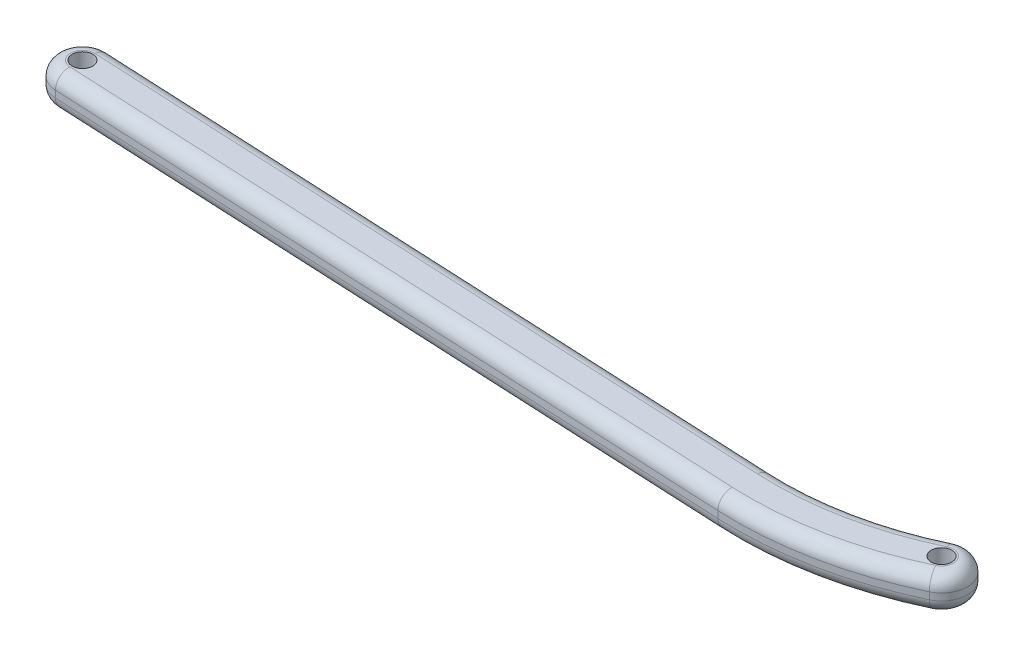
ISO-10303-21;
HEADER;
FILE_DESCRIPTION(('STEP AP214'),'2;1');
FILE_NAME('part.step','',(''),(''),'','','');
FILE_SCHEMA(('AUTOMOTIVE_DESIGN { 1 0 10303 214 1 1 1 1 }'));
ENDSEC;
DATA;
#1=APPLICATION_CONTEXT('core data for automotive mechanical design processes');
#2=APPLICATION_PROTOCOL_DEFINITION('international standard','automotive_design',2000,#1);
#3=PRODUCT_CONTEXT('',#1,'mechanical');
#4=PRODUCT('Part','Part','',(#3));
#5=PRODUCT_RELATED_PRODUCT_CATEGORY('part','',(#4));
#6=PRODUCT_DEFINITION_FORMATION('','',#4);
#7=PRODUCT_DEFINITION_CONTEXT('part definition',#1,'design');
#8=PRODUCT_DEFINITION('design','',#6,#7);
#9=PRODUCT_DEFINITION_SHAPE('','',#8);
#10=(LENGTH_UNIT() NAMED_UNIT(*) SI_UNIT(.MILLI.,.METRE.));
#11=(NAMED_UNIT(*) PLANE_ANGLE_UNIT() SI_UNIT($,.RADIAN.));
#12=(NAMED_UNIT(*) SI_UNIT($,.STERADIAN.) SOLID_ANGLE_UNIT());
#13=UNCERTAINTY_MEASURE_WITH_UNIT(LENGTH_MEASURE(1.E-05),#10,'distance_accuracy_value','');
#14=(GEOMETRIC_REPRESENTATION_CONTEXT(3) GLOBAL_UNCERTAINTY_ASSIGNED_CONTEXT((#13)) GLOBAL_UNIT_ASSIGNED_CONTEXT((#10,
#11,#12)) REPRESENTATION_CONTEXT('',''));
#15=CARTESIAN_POINT('',(0.,0.,0.));
#16=DIRECTION('',(0.,0.,1.));
#17=DIRECTION('',(1.,0.,0.));
#18=AXIS2_PLACEMENT_3D('',#15,#16,#17);
#19=CARTESIAN_POINT('',(0.,5.,0.));
#20=DIRECTION('',(0.,1.,0.));
#21=DIRECTION('',(0.,0.,1.));
#22=AXIS2_PLACEMENT_3D('',#19,#20,#21);
#23=PLANE('',#22);
#24=DIRECTION('',(0.998881638121411,0.,0.0472807891631148));
#25=VECTOR('',#24,1.);
#26=CARTESIAN_POINT('',(-47.8343285329409,5.,13.0731730269991));
#27=LINE('',#26,#25);
#28=CARTESIAN_POINT('',(-250.165482762071,5.,3.49608573342492));
#29=VERTEX_POINT('',#28);
#30=CARTESIAN_POINT('',(-47.8343285329408,5.,13.0731730269991));
#31=VERTEX_POINT('',#30);
#32=EDGE_CURVE('E58',#29,#31,#27,.T.);
#33=ORIENTED_EDGE('',*,*,#32,.T.);
#34=CARTESIAN_POINT('',(-42.9407668545585,5.,-90.3110765185669));
#35=DIRECTION('',(0.,1.,0.));
#36=DIRECTION('',(0.,0.,1.));
#37=AXIS2_PLACEMENT_3D('',#34,#35,#36);
#38=CIRCLE('',#37,103.5);
#39=CARTESIAN_POINT('',(1.50292683990958,5.,3.16088767814984));
#40=VERTEX_POINT('',#39);
#41=EDGE_CURVE('E141',#31,#40,#38,.T.);
#42=ORIENTED_EDGE('',*,*,#41,.T.);
#43=CARTESIAN_POINT('',(0.,5.,0.));
#44=DIRECTION('',(0.,1.,0.));
#45=DIRECTION('',(0.,0.,1.));
#46=AXIS2_PLACEMENT_3D('',#43,#44,#45);
#47=CIRCLE('',#46,3.50000000000001);
#48=CARTESIAN_POINT('',(-1.50292683990953,5.,-3.16088767814986));
#49=VERTEX_POINT('',#48);
#50=EDGE_CURVE('E165',#40,#49,#47,.T.);
#51=ORIENTED_EDGE('',*,*,#50,.T.);
#52=CARTESIAN_POINT('',(-42.9407668545585,5.,-90.3110765185669));
#53=DIRECTION('',(0.,1.,0.));
#54=DIRECTION('',(0.,0.,1.));
#55=AXIS2_PLACEMENT_3D('',#52,#53,#54);
#56=CIRCLE('',#55,96.5000000000001);
#57=CARTESIAN_POINT('',(-47.503363008799,5.,6.08100156014926));
#58=VERTEX_POINT('',#57);
#59=EDGE_CURVE('E267',#49,#58,#56,.F.);
#60=ORIENTED_EDGE('',*,*,#59,.T.);
#61=DIRECTION('',(-0.998881638121411,0.,-0.0472807891631146));
#62=VECTOR('',#61,1.);
#63=CARTESIAN_POINT('',(-249.834517237929,5.,-3.49608573342491));
#64=LINE('',#63,#62);
#65=CARTESIAN_POINT('',(-249.834517237929,5.,-3.49608573342491));
#66=VERTEX_POINT('',#65);
#67=EDGE_CURVE('E269',#58,#66,#64,.T.);
#68=ORIENTED_EDGE('',*,*,#67,.T.);
#69=CARTESIAN_POINT('',(-250.,5.,0.));
#70=DIRECTION('',(0.,1.,0.));
#71=DIRECTION('',(0.,0.,1.));
#72=AXIS2_PLACEMENT_3D('',#69,#70,#71);
#73=CIRCLE('',#72,3.49999999999998);
#74=EDGE_CURVE('E63',#66,#29,#73,.T.);
#75=ORIENTED_EDGE('',*,*,#74,.T.);
#76=EDGE_LOOP('',(#33,#42,#51,#60,#68,#75));
#77=FACE_BOUND('',#76,.T.);
#78=CARTESIAN_POINT('',(0.,5.,0.));
#79=DIRECTION('',(0.,1.,0.));
#80=DIRECTION('',(0.,0.,1.));
#81=AXIS2_PLACEMENT_3D('',#78,#79,#80);
#82=CIRCLE('',#81,3.);
#83=CARTESIAN_POINT('',(0.,5.,3.));
#84=VERTEX_POINT('',#83);
#85=EDGE_CURVE('E154',#84,#84,#82,.T.);
#86=ORIENTED_EDGE('',*,*,#85,.F.);
#87=EDGE_LOOP('',(#86));
#88=FACE_BOUND('',#87,.T.);
#89=CARTESIAN_POINT('',(-250.,5.,0.));
#90=DIRECTION('',(0.,1.,0.));
#91=DIRECTION('',(0.,0.,1.));
#92=AXIS2_PLACEMENT_3D('',#89,#90,#91);
#93=CIRCLE('',#92,2.99999999999999);
#94=CARTESIAN_POINT('',(-250.,5.,2.99999999999999));
#95=VERTEX_POINT('',#94);
#96=EDGE_CURVE('E213',#95,#95,#93,.T.);
#97=ORIENTED_EDGE('',*,*,#96,.F.);
#98=EDGE_LOOP('',(#97));
#99=FACE_BOUND('',#98,.T.);
#100=ADVANCED_FACE('F41',(#77,#88,#99),#23,.T.);
#101=CARTESIAN_POINT('',(0.,-5.,0.));
#102=DIRECTION('',(0.,1.,0.));
#103=DIRECTION('',(0.,0.,1.));
#104=AXIS2_PLACEMENT_3D('',#101,#102,#103);
#105=PLANE('',#104);
#106=CARTESIAN_POINT('',(0.,-5.,0.));
#107=DIRECTION('',(0.,1.,0.));
#108=DIRECTION('',(0.,0.,1.));
#109=AXIS2_PLACEMENT_3D('',#106,#107,#108);
#110=CIRCLE('',#109,3.50000000000001);
#111=CARTESIAN_POINT('',(-1.50292683990953,-5.,-3.16088767814986));
#112=VERTEX_POINT('',#111);
#113=CARTESIAN_POINT('',(1.50292683990958,-5.,3.16088767814984));
#114=VERTEX_POINT('',#113);
#115=EDGE_CURVE('E237',#112,#114,#110,.F.);
#116=ORIENTED_EDGE('',*,*,#115,.T.);
#117=CARTESIAN_POINT('',(-42.9407668545585,-5.,-90.3110765185669));
#118=DIRECTION('',(0.,1.,0.));
#119=DIRECTION('',(0.,0.,1.));
#120=AXIS2_PLACEMENT_3D('',#117,#118,#119);
#121=CIRCLE('',#120,103.5);
#122=CARTESIAN_POINT('',(-47.8343285329408,-5.,13.0731730269991));
#123=VERTEX_POINT('',#122);
#124=EDGE_CURVE('E247',#114,#123,#121,.F.);
#125=ORIENTED_EDGE('',*,*,#124,.T.);
#126=DIRECTION('',(0.998881638121411,0.,0.0472807891631148));
#127=VECTOR('',#126,1.);
#128=CARTESIAN_POINT('',(-0.724351018042631,-5.,15.3030637661562));
#129=LINE('',#128,#127);
#130=CARTESIAN_POINT('',(-250.165482762071,-5.,3.49608573342492));
#131=VERTEX_POINT('',#130);
#132=EDGE_CURVE('E245',#123,#131,#129,.F.);
#133=ORIENTED_EDGE('',*,*,#132,.T.);
#134=CARTESIAN_POINT('',(-250.,-5.,0.));
#135=DIRECTION('',(0.,1.,0.));
#136=DIRECTION('',(0.,0.,1.));
#137=AXIS2_PLACEMENT_3D('',#134,#135,#136);
#138=CIRCLE('',#137,3.49999999999998);
#139=CARTESIAN_POINT('',(-249.834517237929,-5.,-3.49608573342491));
#140=VERTEX_POINT('',#139);
#141=EDGE_CURVE('E243',#131,#140,#138,.F.);
#142=ORIENTED_EDGE('',*,*,#141,.T.);
#143=DIRECTION('',(-0.998881638121411,0.,-0.0472807891631146));
#144=VECTOR('',#143,1.);
#145=CARTESIAN_POINT('',(-0.393385493900823,-5.,8.31089229930632));
#146=LINE('',#145,#144);
#147=CARTESIAN_POINT('',(-47.503363008799,-5.,6.08100156014927));
#148=VERTEX_POINT('',#147);
#149=EDGE_CURVE('E241',#140,#148,#146,.F.);
#150=ORIENTED_EDGE('',*,*,#149,.T.);
#151=CARTESIAN_POINT('',(-42.9407668545585,-5.,-90.3110765185669));
#152=DIRECTION('',(0.,1.,0.));
#153=DIRECTION('',(0.,0.,1.));
#154=AXIS2_PLACEMENT_3D('',#151,#152,#153);
#155=CIRCLE('',#154,96.5000000000001);
#156=EDGE_CURVE('E239',#148,#112,#155,.T.);
#157=ORIENTED_EDGE('',*,*,#156,.T.);
#158=EDGE_LOOP('',(#116,#125,#133,#142,#150,#157));
#159=FACE_BOUND('',#158,.T.);
#160=CARTESIAN_POINT('',(0.,-5.,0.));
#161=DIRECTION('',(0.,1.,0.));
#162=DIRECTION('',(0.,0.,1.));
#163=AXIS2_PLACEMENT_3D('',#160,#161,#162);
#164=CIRCLE('',#163,3.);
#165=CARTESIAN_POINT('',(0.,-5.,3.));
#166=VERTEX_POINT('',#165);
#167=EDGE_CURVE('E218',#166,#166,#164,.T.);
#168=ORIENTED_EDGE('',*,*,#167,.T.);
#169=EDGE_LOOP('',(#168));
#170=FACE_BOUND('',#169,.T.);
#171=CARTESIAN_POINT('',(-250.,-5.,0.));
#172=DIRECTION('',(0.,1.,0.));
#173=DIRECTION('',(0.,0.,1.));
#174=AXIS2_PLACEMENT_3D('',#171,#172,#173);
#175=CIRCLE('',#174,2.99999999999999);
#176=CARTESIAN_POINT('',(-250.,-5.,2.99999999999999));
#177=VERTEX_POINT('',#176);
#178=EDGE_CURVE('E207',#177,#177,#175,.T.);
#179=ORIENTED_EDGE('',*,*,#178,.T.);
#180=EDGE_LOOP('',(#179));
#181=FACE_BOUND('',#180,.T.);
#182=ADVANCED_FACE('F311',(#159,#170,#181),#105,.F.);
#183=CARTESIAN_POINT('',(0.,5.,0.));
#184=DIRECTION('',(0.,-1.,0.));
#185=DIRECTION('',(0.,0.,-1.));
#186=AXIS2_PLACEMENT_3D('',#183,#184,#185);
#187=CYLINDRICAL_SURFACE('',#186,7.50000000000001);
#188=DIRECTION('',(0.,-1.,0.));
#189=VECTOR('',#188,1.);
#190=CARTESIAN_POINT('',(3.22055751409193,5.,6.77333073889255));
#191=LINE('',#190,#189);
#192=CARTESIAN_POINT('',(3.22055751409193,1.,6.77333073889255));
#193=VERTEX_POINT('',#192);
#194=CARTESIAN_POINT('',(3.22055751409193,-1.,6.77333073889255));
#195=VERTEX_POINT('',#194);
#196=EDGE_CURVE('E134',#193,#195,#191,.T.);
#197=ORIENTED_EDGE('',*,*,#196,.T.);
#198=CARTESIAN_POINT('',(0.,-1.,0.));
#199=DIRECTION('',(0.,1.,0.));
#200=DIRECTION('',(0.,0.,1.));
#201=AXIS2_PLACEMENT_3D('',#198,#199,#200);
#202=CIRCLE('',#201,7.50000000000001);
#203=CARTESIAN_POINT('',(-3.22055751409185,-1.,-6.7733307388925));
#204=VERTEX_POINT('',#203);
#205=EDGE_CURVE('E11',#195,#204,#202,.T.);
#206=ORIENTED_EDGE('',*,*,#205,.T.);
#207=DIRECTION('',(0.,-1.,0.));
#208=VECTOR('',#207,1.);
#209=CARTESIAN_POINT('',(-3.22055751409185,5.,-6.7733307388925));
#210=LINE('',#209,#208);
#211=CARTESIAN_POINT('',(-3.22055751409185,1.,-6.7733307388925));
#212=VERTEX_POINT('',#211);
#213=EDGE_CURVE('E136',#212,#204,#210,.T.);
#214=ORIENTED_EDGE('',*,*,#213,.F.);
#215=CARTESIAN_POINT('',(0.,1.,0.));
#216=DIRECTION('',(0.,1.,0.));
#217=DIRECTION('',(0.,0.,1.));
#218=AXIS2_PLACEMENT_3D('',#215,#216,#217);
#219=CIRCLE('',#218,7.50000000000001);
#220=EDGE_CURVE('E50',#212,#193,#219,.F.);
#221=ORIENTED_EDGE('',*,*,#220,.T.);
#222=EDGE_LOOP('',(#197,#206,#214,#221));
#223=FACE_BOUND('',#222,.T.);
#224=ADVANCED_FACE('F133',(#223),#187,.T.);
#225=CARTESIAN_POINT('',(-42.9407668545585,5.,-90.3110765185669));
#226=DIRECTION('',(0.,-1.,0.));
#227=DIRECTION('',(0.,0.,-1.));
#228=AXIS2_PLACEMENT_3D('',#225,#226,#227);
#229=CYLINDRICAL_SURFACE('',#228,92.5000000000001);
#230=ORIENTED_EDGE('',*,*,#213,.T.);
#231=CARTESIAN_POINT('',(-42.9407668545585,-1.,-90.3110765185669));
#232=DIRECTION('',(0.,1.,0.));
#233=DIRECTION('',(0.,0.,1.));
#234=AXIS2_PLACEMENT_3D('',#231,#232,#233);
#235=CIRCLE('',#234,92.5000000000001);
#236=CARTESIAN_POINT('',(-47.3142398521466,-1.,2.08547500766361));
#237=VERTEX_POINT('',#236);
#238=EDGE_CURVE('E264',#204,#237,#235,.F.);
#239=ORIENTED_EDGE('',*,*,#238,.T.);
#240=DIRECTION('',(0.,-1.,0.));
#241=VECTOR('',#240,1.);
#242=CARTESIAN_POINT('',(-47.3142398521466,5.,2.08547500766361));
#243=LINE('',#242,#241);
#244=CARTESIAN_POINT('',(-47.3142398521466,1.,2.08547500766361));
#245=VERTEX_POINT('',#244);
#246=EDGE_CURVE('E232',#245,#237,#243,.T.);
#247=ORIENTED_EDGE('',*,*,#246,.F.);
#248=CARTESIAN_POINT('',(-42.9407668545585,1.,-90.3110765185669));
#249=DIRECTION('',(0.,1.,0.));
#250=DIRECTION('',(0.,0.,1.));
#251=AXIS2_PLACEMENT_3D('',#248,#249,#250);
#252=CIRCLE('',#251,92.5000000000001);
#253=EDGE_CURVE('E262',#245,#212,#252,.T.);
#254=ORIENTED_EDGE('',*,*,#253,.T.);
#255=EDGE_LOOP('',(#230,#239,#247,#254));
#256=FACE_BOUND('',#255,.T.);
#257=ADVANCED_FACE('F278',(#256),#229,.F.);
#258=CARTESIAN_POINT('',(-47.3142398521466,5.,2.08547500766361));
#259=DIRECTION('',(-0.0472807891631146,0.,0.998881638121411));
#260=DIRECTION('',(0.998881638121411,0.,0.0472807891631146));
#261=AXIS2_PLACEMENT_3D('',#258,#259,#260);
#262=PLANE('',#261);
#263=ORIENTED_EDGE('',*,*,#246,.T.);
#264=DIRECTION('',(-0.998881638121411,0.,-0.0472807891631146));
#265=VECTOR('',#264,1.);
#266=CARTESIAN_POINT('',(-47.3142398521466,-1.,2.08547500766361));
#267=LINE('',#266,#265);
#268=CARTESIAN_POINT('',(-249.645394081277,-1.,-7.49161228591056));
#269=VERTEX_POINT('',#268);
#270=EDGE_CURVE('E260',#237,#269,#267,.T.);
#271=ORIENTED_EDGE('',*,*,#270,.T.);
#272=DIRECTION('',(0.,-1.,0.));
#273=VECTOR('',#272,1.);
#274=CARTESIAN_POINT('',(-249.645394081277,5.,-7.49161228591056));
#275=LINE('',#274,#273);
#276=CARTESIAN_POINT('',(-249.645394081277,1.,-7.49161228591056));
#277=VERTEX_POINT('',#276);
#278=EDGE_CURVE('E229',#277,#269,#275,.T.);
#279=ORIENTED_EDGE('',*,*,#278,.F.);
#280=DIRECTION('',(-0.998881638121411,0.,-0.0472807891631146));
#281=VECTOR('',#280,1.);
#282=CARTESIAN_POINT('',(-47.3142398521466,1.,2.08547500766361));
#283=LINE('',#282,#281);
#284=EDGE_CURVE('E258',#277,#245,#283,.F.);
#285=ORIENTED_EDGE('',*,*,#284,.T.);
#286=EDGE_LOOP('',(#263,#271,#279,#285));
#287=FACE_BOUND('',#286,.T.);
#288=ADVANCED_FACE('F329',(#287),#262,.F.);
#289=CARTESIAN_POINT('',(-250.,5.,0.));
#290=DIRECTION('',(0.,-1.,0.));
#291=DIRECTION('',(0.,0.,-1.));
#292=AXIS2_PLACEMENT_3D('',#289,#290,#291);
#293=CYLINDRICAL_SURFACE('',#292,7.49999999999998);
#294=ORIENTED_EDGE('',*,*,#278,.T.);
#295=CARTESIAN_POINT('',(-250.,-1.,0.));
#296=DIRECTION('',(0.,1.,0.));
#297=DIRECTION('',(0.,0.,1.));
#298=AXIS2_PLACEMENT_3D('',#295,#296,#297);
#299=CIRCLE('',#298,7.49999999999998);
#300=CARTESIAN_POINT('',(-250.354605918723,-1.,7.49161228591056));
#301=VERTEX_POINT('',#300);
#302=EDGE_CURVE('E256',#269,#301,#299,.T.);
#303=ORIENTED_EDGE('',*,*,#302,.T.);
#304=DIRECTION('',(0.,-1.,0.));
#305=VECTOR('',#304,1.);
#306=CARTESIAN_POINT('',(-250.354605918723,5.,7.49161228591056));
#307=LINE('',#306,#305);
#308=CARTESIAN_POINT('',(-250.354605918723,1.,7.49161228591056));
#309=VERTEX_POINT('',#308);
#310=EDGE_CURVE('E226',#309,#301,#307,.T.);
#311=ORIENTED_EDGE('',*,*,#310,.F.);
#312=CARTESIAN_POINT('',(-250.,1.,0.));
#313=DIRECTION('',(0.,1.,0.));
#314=DIRECTION('',(0.,0.,1.));
#315=AXIS2_PLACEMENT_3D('',#312,#313,#314);
#316=CIRCLE('',#315,7.49999999999998);
#317=EDGE_CURVE('E254',#309,#277,#316,.F.);
#318=ORIENTED_EDGE('',*,*,#317,.T.);
#319=EDGE_LOOP('',(#294,#303,#311,#318));
#320=FACE_BOUND('',#319,.T.);
#321=ADVANCED_FACE('F291',(#320),#293,.T.);
#322=CARTESIAN_POINT('',(-48.0234516895933,5.,17.0686995794848));
#323=DIRECTION('',(0.0472807891631148,0.,-0.998881638121411));
#324=DIRECTION('',(-0.998881638121411,0.,-0.0472807891631148));
#325=AXIS2_PLACEMENT_3D('',#322,#323,#324);
#326=PLANE('',#325);
#327=ORIENTED_EDGE('',*,*,#310,.T.);
#328=DIRECTION('',(0.998881638121411,0.,0.0472807891631148));
#329=VECTOR('',#328,1.);
#330=CARTESIAN_POINT('',(-48.0234516895933,-1.,17.0686995794848));
#331=LINE('',#330,#329);
#332=CARTESIAN_POINT('',(-48.0234516895933,-1.,17.0686995794848));
#333=VERTEX_POINT('',#332);
#334=EDGE_CURVE('E252',#301,#333,#331,.T.);
#335=ORIENTED_EDGE('',*,*,#334,.T.);
#336=DIRECTION('',(0.,-1.,0.));
#337=VECTOR('',#336,1.);
#338=CARTESIAN_POINT('',(-48.0234516895933,5.,17.0686995794848));
#339=LINE('',#338,#337);
#340=CARTESIAN_POINT('',(-48.0234516895933,1.,17.0686995794848));
#341=VERTEX_POINT('',#340);
#342=EDGE_CURVE('E153',#341,#333,#339,.T.);
#343=ORIENTED_EDGE('',*,*,#342,.F.);
#344=DIRECTION('',(0.998881638121411,0.,0.0472807891631148));
#345=VECTOR('',#344,1.);
#346=CARTESIAN_POINT('',(-250.354605918723,1.,7.49161228591056));
#347=LINE('',#346,#345);
#348=EDGE_CURVE('E250',#341,#309,#347,.F.);
#349=ORIENTED_EDGE('',*,*,#348,.T.);
#350=EDGE_LOOP('',(#327,#335,#343,#349));
#351=FACE_BOUND('',#350,.T.);
#352=ADVANCED_FACE('F288',(#351),#326,.F.);
#353=CARTESIAN_POINT('',(-42.9407668545585,5.,-90.3110765185669));
#354=DIRECTION('',(0.,-1.,0.));
#355=DIRECTION('',(0.,0.,-1.));
#356=AXIS2_PLACEMENT_3D('',#353,#354,#355);
#357=CYLINDRICAL_SURFACE('',#356,107.5);
#358=ORIENTED_EDGE('',*,*,#342,.T.);
#359=CARTESIAN_POINT('',(-42.9407668545585,-1.,-90.3110765185669));
#360=DIRECTION('',(0.,1.,0.));
#361=DIRECTION('',(0.,0.,1.));
#362=AXIS2_PLACEMENT_3D('',#359,#360,#361);
#363=CIRCLE('',#362,107.5);
#364=EDGE_CURVE('E152',#333,#195,#363,.T.);
#365=ORIENTED_EDGE('',*,*,#364,.T.);
#366=ORIENTED_EDGE('',*,*,#196,.F.);
#367=CARTESIAN_POINT('',(-42.9407668545585,1.,-90.3110765185669));
#368=DIRECTION('',(0.,1.,0.));
#369=DIRECTION('',(0.,0.,1.));
#370=AXIS2_PLACEMENT_3D('',#367,#368,#369);
#371=CIRCLE('',#370,107.5);
#372=EDGE_CURVE('E149',#193,#341,#371,.F.);
#373=ORIENTED_EDGE('',*,*,#372,.T.);
#374=EDGE_LOOP('',(#358,#365,#366,#373));
#375=FACE_BOUND('',#374,.T.);
#376=ADVANCED_FACE('F148',(#375),#357,.T.);
#377=CARTESIAN_POINT('',(0.,5.,0.));
#378=DIRECTION('',(0.,-1.,0.));
#379=DIRECTION('',(0.,0.,-1.));
#380=AXIS2_PLACEMENT_3D('',#377,#378,#379);
#381=CYLINDRICAL_SURFACE('',#380,3.);
#382=ORIENTED_EDGE('',*,*,#85,.T.);
#383=EDGE_LOOP('',(#382));
#384=FACE_BOUND('',#383,.T.);
#385=ORIENTED_EDGE('',*,*,#167,.F.);
#386=EDGE_LOOP('',(#385));
#387=FACE_BOUND('',#386,.T.);
#388=ADVANCED_FACE('F320',(#384,#387),#381,.F.);
#389=CARTESIAN_POINT('',(-250.,5.,0.));
#390=DIRECTION('',(0.,-1.,0.));
#391=DIRECTION('',(0.,0.,-1.));
#392=AXIS2_PLACEMENT_3D('',#389,#390,#391);
#393=CYLINDRICAL_SURFACE('',#392,2.99999999999999);
#394=ORIENTED_EDGE('',*,*,#96,.T.);
#395=EDGE_LOOP('',(#394));
#396=FACE_BOUND('',#395,.T.);
#397=ORIENTED_EDGE('',*,*,#178,.F.);
#398=EDGE_LOOP('',(#397));
#399=FACE_BOUND('',#398,.T.);
#400=ADVANCED_FACE('F372',(#396,#399),#393,.F.);
#401=CARTESIAN_POINT('',(-47.503363008799,-1.,6.08100156014925));
#402=DIRECTION('',(-0.998881638121411,0.,-0.0472807891631146));
#403=DIRECTION('',(-0.0472807891631146,0.,0.998881638121411));
#404=AXIS2_PLACEMENT_3D('',#401,#402,#403);
#405=CYLINDRICAL_SURFACE('',#404,4.);
#406=CARTESIAN_POINT('',(-47.503363008799,-1.,6.08100156014925));
#407=DIRECTION('',(0.998881638121411,0.,0.0472807891631153));
#408=DIRECTION('',(0.0472807891631153,0.,-0.998881638121411));
#409=AXIS2_PLACEMENT_3D('',#406,#407,#408);
#410=CIRCLE('',#409,4.);
#411=EDGE_CURVE('E200',#148,#237,#410,.T.);
#412=ORIENTED_EDGE('',*,*,#411,.F.);
#413=ORIENTED_EDGE('',*,*,#149,.F.);
#414=CARTESIAN_POINT('',(-249.834517237929,-1.,-3.49608573342491));
#415=DIRECTION('',(-0.998881638121411,0.,-0.0472807891631136));
#416=DIRECTION('',(-0.0472807891631136,0.,0.998881638121411));
#417=AXIS2_PLACEMENT_3D('',#414,#415,#416);
#418=CIRCLE('',#417,4.);
#419=EDGE_CURVE('E170',#269,#140,#418,.T.);
#420=ORIENTED_EDGE('',*,*,#419,.F.);
#421=ORIENTED_EDGE('',*,*,#270,.F.);
#422=EDGE_LOOP('',(#412,#413,#420,#421));
#423=FACE_BOUND('',#422,.T.);
#424=ADVANCED_FACE('F368',(#423),#405,.T.);
#425=CARTESIAN_POINT('',(-250.,-1.,0.));
#426=DIRECTION('',(0.,1.,0.));
#427=DIRECTION('',(0.,0.,1.));
#428=AXIS2_PLACEMENT_3D('',#425,#426,#427);
#429=DEGENERATE_TOROIDAL_SURFACE('',#428,3.49999999999998,4.,.T.);
#430=ORIENTED_EDGE('',*,*,#419,.T.);
#431=ORIENTED_EDGE('',*,*,#141,.F.);
#432=CARTESIAN_POINT('',(-250.165482762071,-1.,3.49608573342492));
#433=DIRECTION('',(0.998881638121411,0.,0.0472807891631205));
#434=DIRECTION('',(0.0472807891631205,0.,-0.998881638121411));
#435=AXIS2_PLACEMENT_3D('',#432,#433,#434);
#436=CIRCLE('',#435,4.);
#437=EDGE_CURVE('E198',#301,#131,#436,.T.);
#438=ORIENTED_EDGE('',*,*,#437,.F.);
#439=ORIENTED_EDGE('',*,*,#302,.F.);
#440=EDGE_LOOP('',(#430,#431,#438,#439));
#441=FACE_BOUND('',#440,.T.);
#442=ADVANCED_FACE('F293',(#441),#429,.T.);
#443=CARTESIAN_POINT('',(-42.9407668545585,-1.,-90.3110765185669));
#444=DIRECTION('',(0.,1.,0.));
#445=DIRECTION('',(0.,0.,1.));
#446=AXIS2_PLACEMENT_3D('',#443,#444,#445);
#447=TOROIDAL_SURFACE('',#446,96.5000000000001,4.);
#448=ORIENTED_EDGE('',*,*,#411,.T.);
#449=ORIENTED_EDGE('',*,*,#238,.F.);
#450=CARTESIAN_POINT('',(-1.50292683990951,-1.,-3.16088767814982));
#451=DIRECTION('',(0.903110765185669,0.,-0.429407668545585));
#452=DIRECTION('',(-0.429407668545585,0.,-0.903110765185669));
#453=AXIS2_PLACEMENT_3D('',#450,#451,#452);
#454=CIRCLE('',#453,4.);
#455=EDGE_CURVE('E193',#112,#204,#454,.T.);
#456=ORIENTED_EDGE('',*,*,#455,.F.);
#457=ORIENTED_EDGE('',*,*,#156,.F.);
#458=EDGE_LOOP('',(#448,#449,#456,#457));
#459=FACE_BOUND('',#458,.T.);
#460=ADVANCED_FACE('F382',(#459),#447,.T.);
#461=CARTESIAN_POINT('',(-47.8343285329408,-1.,13.0731730269991));
#462=DIRECTION('',(0.998881638121411,0.,0.0472807891631148));
#463=DIRECTION('',(0.0472807891631148,0.,-0.998881638121411));
#464=AXIS2_PLACEMENT_3D('',#461,#462,#463);
#465=CYLINDRICAL_SURFACE('',#464,4.);
#466=ORIENTED_EDGE('',*,*,#437,.T.);
#467=ORIENTED_EDGE('',*,*,#132,.F.);
#468=CARTESIAN_POINT('',(-47.8343285329408,-1.,13.0731730269991));
#469=DIRECTION('',(0.998881638121411,0.,0.0472807891631153));
#470=DIRECTION('',(0.0472807891631153,0.,-0.998881638121411));
#471=AXIS2_PLACEMENT_3D('',#468,#469,#470);
#472=CIRCLE('',#471,4.);
#473=EDGE_CURVE('E187',#333,#123,#472,.T.);
#474=ORIENTED_EDGE('',*,*,#473,.F.);
#475=ORIENTED_EDGE('',*,*,#334,.F.);
#476=EDGE_LOOP('',(#466,#467,#474,#475));
#477=FACE_BOUND('',#476,.T.);
#478=ADVANCED_FACE('F298',(#477),#465,.T.);
#479=CARTESIAN_POINT('',(0.,-1.,0.));
#480=DIRECTION('',(0.,1.,0.));
#481=DIRECTION('',(0.,0.,1.));
#482=AXIS2_PLACEMENT_3D('',#479,#480,#481);
#483=DEGENERATE_TOROIDAL_SURFACE('',#482,3.50000000000001,4.,.T.);
#484=ORIENTED_EDGE('',*,*,#455,.T.);
#485=ORIENTED_EDGE('',*,*,#205,.F.);
#486=CARTESIAN_POINT('',(1.50292683990958,-1.,3.16088767814984));
#487=DIRECTION('',(-0.903110765185669,0.,0.429407668545585));
#488=DIRECTION('',(0.429407668545585,0.,0.903110765185669));
#489=AXIS2_PLACEMENT_3D('',#486,#487,#488);
#490=CIRCLE('',#489,4.);
#491=EDGE_CURVE('E183',#114,#195,#490,.T.);
#492=ORIENTED_EDGE('',*,*,#491,.F.);
#493=ORIENTED_EDGE('',*,*,#115,.F.);
#494=EDGE_LOOP('',(#484,#485,#492,#493));
#495=FACE_BOUND('',#494,.T.);
#496=ADVANCED_FACE('F301',(#495),#483,.T.);
#497=CARTESIAN_POINT('',(-42.9407668545585,-1.,-90.3110765185669));
#498=DIRECTION('',(0.,1.,0.));
#499=DIRECTION('',(0.,0.,1.));
#500=AXIS2_PLACEMENT_3D('',#497,#498,#499);
#501=TOROIDAL_SURFACE('',#500,103.5,4.);
#502=ORIENTED_EDGE('',*,*,#473,.T.);
#503=ORIENTED_EDGE('',*,*,#124,.F.);
#504=ORIENTED_EDGE('',*,*,#491,.T.);
#505=ORIENTED_EDGE('',*,*,#364,.F.);
#506=EDGE_LOOP('',(#502,#503,#504,#505));
#507=FACE_BOUND('',#506,.T.);
#508=ADVANCED_FACE('F299',(#507),#501,.T.);
#509=CARTESIAN_POINT('',(-0.393385493900823,1.,8.31089229930632));
#510=DIRECTION('',(0.998881638121411,0.,0.0472807891631146));
#511=DIRECTION('',(0.0472807891631146,0.,-0.998881638121411));
#512=AXIS2_PLACEMENT_3D('',#509,#510,#511);
#513=CYLINDRICAL_SURFACE('',#512,4.);
#514=CARTESIAN_POINT('',(-47.503363008799,1.,6.08100156014925));
#515=DIRECTION('',(0.998881638121411,0.,0.0472807891631153));
#516=DIRECTION('',(0.0472807891631153,0.,-0.998881638121411));
#517=AXIS2_PLACEMENT_3D('',#514,#515,#516);
#518=CIRCLE('',#517,4.);
#519=EDGE_CURVE('E176',#245,#58,#518,.T.);
#520=ORIENTED_EDGE('',*,*,#519,.F.);
#521=ORIENTED_EDGE('',*,*,#284,.F.);
#522=CARTESIAN_POINT('',(-249.834517237929,1.,-3.49608573342491));
#523=DIRECTION('',(-0.998881638121411,0.,-0.0472807891631136));
#524=DIRECTION('',(-0.0472807891631136,0.,0.998881638121411));
#525=AXIS2_PLACEMENT_3D('',#522,#523,#524);
#526=CIRCLE('',#525,4.);
#527=EDGE_CURVE('E45',#66,#277,#526,.T.);
#528=ORIENTED_EDGE('',*,*,#527,.F.);
#529=ORIENTED_EDGE('',*,*,#67,.F.);
#530=EDGE_LOOP('',(#520,#521,#528,#529));
#531=FACE_BOUND('',#530,.T.);
#532=ADVANCED_FACE('F43',(#531),#513,.T.);
#533=CARTESIAN_POINT('',(-250.,1.,0.));
#534=DIRECTION('',(0.,1.,0.));
#535=DIRECTION('',(0.,0.,1.));
#536=AXIS2_PLACEMENT_3D('',#533,#534,#535);
#537=DEGENERATE_TOROIDAL_SURFACE('',#536,3.49999999999998,4.,.T.);
#538=ORIENTED_EDGE('',*,*,#527,.T.);
#539=ORIENTED_EDGE('',*,*,#317,.F.);
#540=CARTESIAN_POINT('',(-250.165482762071,1.,3.49608573342492));
#541=DIRECTION('',(0.998881638121411,0.,0.0472807891631205));
#542=DIRECTION('',(0.0472807891631205,0.,-0.998881638121411));
#543=AXIS2_PLACEMENT_3D('',#540,#541,#542);
#544=CIRCLE('',#543,4.);
#545=EDGE_CURVE('E174',#29,#309,#544,.T.);
#546=ORIENTED_EDGE('',*,*,#545,.F.);
#547=ORIENTED_EDGE('',*,*,#74,.F.);
#548=EDGE_LOOP('',(#538,#539,#546,#547));
#549=FACE_BOUND('',#548,.T.);
#550=ADVANCED_FACE('F283',(#549),#537,.T.);
#551=CARTESIAN_POINT('',(-42.9407668545585,1.,-90.3110765185669));
#552=DIRECTION('',(0.,1.,0.));
#553=DIRECTION('',(0.,0.,1.));
#554=AXIS2_PLACEMENT_3D('',#551,#552,#553);
#555=TOROIDAL_SURFACE('',#554,96.5000000000001,4.);
#556=ORIENTED_EDGE('',*,*,#519,.T.);
#557=ORIENTED_EDGE('',*,*,#59,.F.);
#558=CARTESIAN_POINT('',(-1.50292683990951,1.,-3.16088767814982));
#559=DIRECTION('',(0.903110765185669,0.,-0.429407668545585));
#560=DIRECTION('',(-0.429407668545585,0.,-0.903110765185669));
#561=AXIS2_PLACEMENT_3D('',#558,#559,#560);
#562=CIRCLE('',#561,4.);
#563=EDGE_CURVE('E167',#212,#49,#562,.T.);
#564=ORIENTED_EDGE('',*,*,#563,.F.);
#565=ORIENTED_EDGE('',*,*,#253,.F.);
#566=EDGE_LOOP('',(#556,#557,#564,#565));
#567=FACE_BOUND('',#566,.T.);
#568=ADVANCED_FACE('F275',(#567),#555,.T.);
#569=CARTESIAN_POINT('',(-0.724351018042631,1.,15.3030637661562));
#570=DIRECTION('',(-0.998881638121411,0.,-0.0472807891631148));
#571=DIRECTION('',(-0.0472807891631148,0.,0.998881638121411));
#572=AXIS2_PLACEMENT_3D('',#569,#570,#571);
#573=CYLINDRICAL_SURFACE('',#572,4.);
#574=ORIENTED_EDGE('',*,*,#545,.T.);
#575=ORIENTED_EDGE('',*,*,#348,.F.);
#576=CARTESIAN_POINT('',(-47.8343285329408,1.,13.0731730269991));
#577=DIRECTION('',(0.998881638121411,0.,0.0472807891631153));
#578=DIRECTION('',(0.0472807891631153,0.,-0.998881638121411));
#579=AXIS2_PLACEMENT_3D('',#576,#577,#578);
#580=CIRCLE('',#579,4.);
#581=EDGE_CURVE('E161',#31,#341,#580,.T.);
#582=ORIENTED_EDGE('',*,*,#581,.F.);
#583=ORIENTED_EDGE('',*,*,#32,.F.);
#584=EDGE_LOOP('',(#574,#575,#582,#583));
#585=FACE_BOUND('',#584,.T.);
#586=ADVANCED_FACE('F285',(#585),#573,.T.);
#587=CARTESIAN_POINT('',(0.,1.,0.));
#588=DIRECTION('',(0.,1.,0.));
#589=DIRECTION('',(0.,0.,1.));
#590=AXIS2_PLACEMENT_3D('',#587,#588,#589);
#591=DEGENERATE_TOROIDAL_SURFACE('',#590,3.50000000000001,4.,.T.);
#592=ORIENTED_EDGE('',*,*,#563,.T.);
#593=ORIENTED_EDGE('',*,*,#50,.F.);
#594=CARTESIAN_POINT('',(1.50292683990956,1.,3.16088767814985));
#595=DIRECTION('',(-0.903110765185668,0.,0.429407668545588));
#596=DIRECTION('',(0.429407668545588,0.,0.903110765185668));
#597=AXIS2_PLACEMENT_3D('',#594,#595,#596);
#598=CIRCLE('',#597,4.);
#599=EDGE_CURVE('E159',#193,#40,#598,.T.);
#600=ORIENTED_EDGE('',*,*,#599,.F.);
#601=ORIENTED_EDGE('',*,*,#220,.F.);
#602=EDGE_LOOP('',(#592,#593,#600,#601));
#603=FACE_BOUND('',#602,.T.);
#604=ADVANCED_FACE('F164',(#603),#591,.T.);
#605=CARTESIAN_POINT('',(-42.9407668545585,1.,-90.3110765185669));
#606=DIRECTION('',(0.,1.,0.));
#607=DIRECTION('',(0.,0.,1.));
#608=AXIS2_PLACEMENT_3D('',#605,#606,#607);
#609=TOROIDAL_SURFACE('',#608,103.5,4.);
#610=ORIENTED_EDGE('',*,*,#581,.T.);
#611=ORIENTED_EDGE('',*,*,#372,.F.);
#612=ORIENTED_EDGE('',*,*,#599,.T.);
#613=ORIENTED_EDGE('',*,*,#41,.F.);
#614=EDGE_LOOP('',(#610,#611,#612,#613));
#615=FACE_BOUND('',#614,.T.);
#616=ADVANCED_FACE('F157',(#615),#609,.T.);
#617=CLOSED_SHELL('',(#100,#182,#224,#257,#288,#321,#352,#376,#388,#400,#424,#442,#460,#478,
#496,#508,#532,#550,#568,#586,#604,#616));
#618=MANIFOLD_SOLID_BREP('B2',#617);
#619=ADVANCED_BREP_SHAPE_REPRESENTATION('',(#18,#618),#14);
#620=SHAPE_DEFINITION_REPRESENTATION(#9,#619);
ENDSEC;
END-ISO-10303-21;
